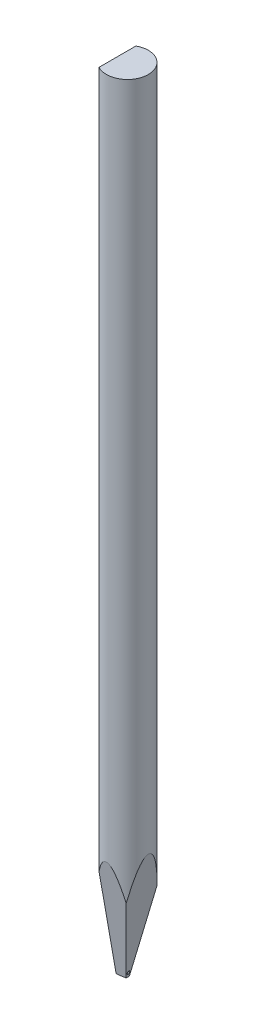
ISO-10303-21;
HEADER;
FILE_DESCRIPTION(('STEP AP214'),'2;1');
FILE_NAME('part.step','',(''),(''),'','','');
FILE_SCHEMA(('AUTOMOTIVE_DESIGN { 1 0 10303 214 1 1 1 1 }'));
ENDSEC;
DATA;
#1=APPLICATION_CONTEXT('core data for automotive mechanical design processes');
#2=APPLICATION_PROTOCOL_DEFINITION('international standard','automotive_design',2000,#1);
#3=PRODUCT_CONTEXT('',#1,'mechanical');
#4=PRODUCT('Part','Part','',(#3));
#5=PRODUCT_RELATED_PRODUCT_CATEGORY('part','',(#4));
#6=PRODUCT_DEFINITION_FORMATION('','',#4);
#7=PRODUCT_DEFINITION_CONTEXT('part definition',#1,'design');
#8=PRODUCT_DEFINITION('design','',#6,#7);
#9=PRODUCT_DEFINITION_SHAPE('','',#8);
#10=(LENGTH_UNIT() NAMED_UNIT(*) SI_UNIT(.MILLI.,.METRE.));
#11=(NAMED_UNIT(*) PLANE_ANGLE_UNIT() SI_UNIT($,.RADIAN.));
#12=(NAMED_UNIT(*) SI_UNIT($,.STERADIAN.) SOLID_ANGLE_UNIT());
#13=UNCERTAINTY_MEASURE_WITH_UNIT(LENGTH_MEASURE(1.E-05),#10,'distance_accuracy_value','');
#14=(GEOMETRIC_REPRESENTATION_CONTEXT(3) GLOBAL_UNCERTAINTY_ASSIGNED_CONTEXT((#13)) GLOBAL_UNIT_ASSIGNED_CONTEXT((#10,
#11,#12)) REPRESENTATION_CONTEXT('',''));
#15=CARTESIAN_POINT('',(0.,0.,0.));
#16=DIRECTION('',(0.,0.,1.));
#17=DIRECTION('',(1.,0.,0.));
#18=AXIS2_PLACEMENT_3D('',#15,#16,#17);
#19=CARTESIAN_POINT('',(0.,0.,0.));
#20=DIRECTION('',(0.,1.,0.));
#21=DIRECTION('',(0.,0.,1.));
#22=AXIS2_PLACEMENT_3D('',#19,#20,#21);
#23=PLANE('',#22);
#24=DIRECTION('',(-1.,0.,0.));
#25=VECTOR('',#24,1.);
#26=CARTESIAN_POINT('',(37.9299393023531,0.,0.024301429259202));
#27=LINE('',#26,#25);
#28=CARTESIAN_POINT('',(-0.302505698926175,0.,0.024301429259202));
#29=VERTEX_POINT('',#28);
#30=CARTESIAN_POINT('',(-0.375920000000002,0.,0.024301429259202));
#31=VERTEX_POINT('',#30);
#32=EDGE_CURVE('E376',#29,#31,#27,.T.);
#33=ORIENTED_EDGE('',*,*,#32,.F.);
#34=CARTESIAN_POINT('',(-0.227825197505043,0.000821082384313734,0.0215810982692062));
#35=CARTESIAN_POINT('',(-0.245034827655447,0.00574587858713153,0.00414270174912001));
#36=CARTESIAN_POINT('',(-0.241524302840157,0.0282854026772107,0.0143490100953686));
#37=CARTESIAN_POINT('',(-0.232761897231027,-0.000191267152315804,0.0250702187356864));
#38=CARTESIAN_POINT('',(-0.245650855646434,0.00566777320241242,0.00770700976054411));
#39=CARTESIAN_POINT('',(-0.244977713848214,0.026157616484449,0.0166688839114718));
#40=CARTESIAN_POINT('',(-0.238431185756585,-0.00123806953368211,0.027930289615228));
#41=CARTESIAN_POINT('',(-0.248388192218129,0.00497262893043278,0.0115103437863978));
#42=CARTESIAN_POINT('',(-0.248913969918457,0.0238423713748454,0.0185705102982331));
#43=CARTESIAN_POINT('',(-0.250793194721189,-0.00297707742583745,0.0322289362925408));
#44=CARTESIAN_POINT('',(-0.255892273738704,0.00341525099514985,0.0177455655134612));
#45=CARTESIAN_POINT('',(-0.257357955889735,0.0193962809886868,0.0214286282586706));
#46=CARTESIAN_POINT('',(-0.257506274585809,-0.00366066852221202,0.0336336714025015));
#47=CARTESIAN_POINT('',(-0.260633657709613,0.00254190370459321,0.0203534609740121));
#48=CARTESIAN_POINT('',(-0.261876654974955,0.0172708330905814,0.0223626195700815));
#49=CARTESIAN_POINT('',(-0.269799835115366,-0.00410994322563168,0.0345696750414885));
#50=CARTESIAN_POINT('',(-0.269751315759274,0.00149116630553639,0.0230126072141926));
#51=CARTESIAN_POINT('',(-0.269946288127882,0.0142679037069781,0.0229849570200847));
#52=CARTESIAN_POINT('',(-0.275323446491675,-0.00403774105700813,0.0344314054213974));
#53=CARTESIAN_POINT('',(-0.274027420527515,0.00118322418916697,0.0235670913464913));
#54=CARTESIAN_POINT('',(-0.273501911955909,0.0132223642176632,0.0228930232292358));
#55=CARTESIAN_POINT('',(-0.286011306031935,-0.00322845548345473,0.0327000352877498));
#56=CARTESIAN_POINT('',(-0.282179914978438,0.00109125813693063,0.0231161412096964));
#57=CARTESIAN_POINT('',(-0.280210477091128,0.0119412986892854,0.0217418562581842));
#58=CARTESIAN_POINT('',(-0.291173148744714,-0.00248730685306159,0.0310980388902579));
#59=CARTESIAN_POINT('',(-0.286149097631656,0.00129894419664579,0.0221276357619358));
#60=CARTESIAN_POINT('',(-0.283360821575895,0.0117107676757025,0.0206767083128105));
#61=CARTESIAN_POINT('',(-0.299602822393734,-0.000801539704433188,0.0267477659134277));
#62=CARTESIAN_POINT('',(-0.292408755866523,0.00191881633869061,0.0190819593298142));
#63=CARTESIAN_POINT('',(-0.288383902424835,0.0118611241504694,0.0177842646529243));
#64=CARTESIAN_POINT('',(-0.303030538955303,0.000103444682686011,0.0241781701007463));
#65=CARTESIAN_POINT('',(-0.294889447090707,0.0023037022246217,0.0171668741087767));
#66=CARTESIAN_POINT('',(-0.290370237180289,0.0121655112151282,0.0160757716097415));
#67=CARTESIAN_POINT('',(-0.308514392850169,0.00172652459697053,0.0183135948687384));
#68=CARTESIAN_POINT('',(-0.298746447297998,0.00298044372071625,0.012879858933677));
#69=CARTESIAN_POINT('',(-0.293503241996811,0.0128466727594801,0.0121764867744927));
#70=CARTESIAN_POINT('',(-0.310606869220775,0.00244921520093865,0.0150414006438955));
#71=CARTESIAN_POINT('',(-0.300152350128904,0.00327523254656574,0.0105128092522198));
#72=CARTESIAN_POINT('',(-0.294672249601443,0.0132211344266295,0.010000844581469));
#73=CARTESIAN_POINT('',(-0.312967619974572,0.00329568497416077,0.00931742185770279));
#74=CARTESIAN_POINT('',(-0.301716686246427,0.00361214202736292,0.00646467066227568));
#75=CARTESIAN_POINT('',(-0.295983169510553,0.013678095082922,0.0061950406152292));
#76=CARTESIAN_POINT('',(-0.313617084874504,0.00354030598861865,0.00697552549228586));
#77=CARTESIAN_POINT('',(-0.302136666185862,0.00370603321499294,0.00483113633064015));
#78=CARTESIAN_POINT('',(-0.29634080920666,0.0138168290783898,0.00463794216868613));
#79=CARTESIAN_POINT('',(-0.314563628458891,0.00389545139863984,0.000787930489150023));
#80=CARTESIAN_POINT('',(-0.302752910089274,0.00384367854693773,0.000535544065680751));
#81=CARTESIAN_POINT('',(-0.296862391385962,0.0140175043608145,0.000523885411308966));
#82=CARTESIAN_POINT('',(-0.314417113795285,0.00383807612208008,-0.00311886327876337));
#83=CARTESIAN_POINT('',(-0.302660770954939,0.00382288355677158,-0.00213939502445816));
#84=CARTESIAN_POINT('',(-0.296782271000047,0.013983779546503,-0.0020736943094739));
#85=CARTESIAN_POINT('',(-0.312657905792592,0.00318275039907247,-0.0106634982811221));
#86=CARTESIAN_POINT('',(-0.301511531396563,0.00356664435177186,-0.00740601427595318));
#87=CARTESIAN_POINT('',(-0.295811667919384,0.0136160577081122,-0.007090030478481));
#88=CARTESIAN_POINT('',(-0.311045007020005,0.0025847242100467,-0.0143013017540773));
#89=CARTESIAN_POINT('',(-0.300461562154091,0.00333278827930966,-0.00998164829714308));
#90=CARTESIAN_POINT('',(-0.294921071680773,0.0132820186114908,-0.00950876181954922));
#91=CARTESIAN_POINT('',(-0.306440159650584,0.00108938252153803,-0.020880290888427));
#92=CARTESIAN_POINT('',(-0.29729910359028,0.00271570653149375,-0.0147410667047117));
#93=CARTESIAN_POINT('',(-0.292324145606441,0.0125632939646946,-0.0138830517805381));
#94=CARTESIAN_POINT('',(-0.30345573705115,0.000193707650167118,-0.0238251473132877));
#95=CARTESIAN_POINT('',(-0.295199673901025,0.00233432378586256,-0.0169294269223584));
#96=CARTESIAN_POINT('',(-0.290622265671655,0.0121788928930591,-0.0158410510464991));
#97=CARTESIAN_POINT('',(-0.296432365420741,-0.00148605921301844,-0.028628143513798));
#98=CARTESIAN_POINT('',(-0.290078907132247,0.00166019233881121,-0.0204132760605369));
#99=CARTESIAN_POINT('',(-0.286507609386632,0.0117486224899564,-0.0190345048786184));
#100=CARTESIAN_POINT('',(-0.292421815697956,-0.00227239044141986,-0.0305117439313388));
#101=CARTESIAN_POINT('',(-0.287063238453745,0.00136248817850754,-0.0217461800460033));
#102=CARTESIAN_POINT('',(-0.284113782114589,0.0116944848100444,-0.0202868879163018));
#103=CARTESIAN_POINT('',(-0.283849340075187,-0.00342900818647396,-0.0331572963874476));
#104=CARTESIAN_POINT('',(-0.280569772361123,0.0010856610224745,-0.0233043318321131));
#105=CARTESIAN_POINT('',(-0.278862882478683,0.0121596022092071,-0.0220458836090603));
#106=CARTESIAN_POINT('',(-0.279295190972908,-0.00380452880153439,-0.0339333987496222));
#107=CARTESIAN_POINT('',(-0.277047639383919,0.00110327745740793,-0.023545154910523));
#108=CARTESIAN_POINT('',(-0.276012181647064,0.0126714724574782,-0.0225619046424186));
#109=CARTESIAN_POINT('',(-0.269701463152515,-0.00410629730163296,-0.0345630378480585));
#110=CARTESIAN_POINT('',(-0.269746394801657,0.00148426748942568,-0.0229936986933425));
#111=CARTESIAN_POINT('',(-0.269881702633036,0.0142919892466934,-0.0229805440307946));
#112=CARTESIAN_POINT('',(-0.264653504068372,-0.00399168402953402,-0.0343326317027686));
#113=CARTESIAN_POINT('',(-0.2659129984888,0.00189006473089505,-0.0220765629153878));
#114=CARTESIAN_POINT('',(-0.266586044859265,0.0154476236056216,-0.0228273497835158));
#115=CARTESIAN_POINT('',(-0.253793893841115,-0.00329673403971204,-0.0328464784638622));
#116=CARTESIAN_POINT('',(-0.25804777168414,0.00299938327773119,-0.0189984846186303));
#117=CARTESIAN_POINT('',(-0.259381389799495,0.0184306001459407,-0.0218392245471482));
#118=CARTESIAN_POINT('',(-0.248036924026835,-0.00262603076696128,-0.0313908642611835));
#119=CARTESIAN_POINT('',(-0.25412124898949,0.00376990506999124,-0.0165248798583642));
#120=CARTESIAN_POINT('',(-0.255484648351846,0.0203469392501991,-0.0208714043450132));
#121=CARTESIAN_POINT('',(-0.239413210970669,-0.00134157330358348,-0.028165632697237));
#122=CARTESIAN_POINT('',(-0.249253851903819,0.00480639473717398,-0.0119576174475555));
#123=CARTESIAN_POINT('',(-0.24957588621242,0.0235275660937497,-0.0187269870547679));
#124=CARTESIAN_POINT('',(-0.236308205853108,-0.000811429626366428,-0.0267516692029636));
#125=CARTESIAN_POINT('',(-0.24771983337294,0.0051601389311344,-0.0100184273300864));
#126=CARTESIAN_POINT('',(-0.247431093294174,0.0247477519269788,-0.0177868599027238));
#127=CARTESIAN_POINT('',(-0.230477145019733,0.000272654770886545,-0.0234963613029371));
#128=CARTESIAN_POINT('',(-0.245473970538167,0.00567015630017144,-0.00606795690835905));
#129=CARTESIAN_POINT('',(-0.243380619980735,0.0271372754227797,-0.0156224452219534));
#130=CARTESIAN_POINT('',(-0.227751727404986,0.000826633560826962,-0.0216543108103016));
#131=CARTESIAN_POINT('',(-0.244812549085203,0.00581424778672661,-0.00404223108031309));
#132=CARTESIAN_POINT('',(-0.241475342731792,0.0283065252460894,-0.0143976882246357));
#133=CARTESIAN_POINT('',(-0.225275643428538,0.00135586198968455,-0.0195888989002276));
#134=CARTESIAN_POINT('',(-0.244757355961534,0.00576877420614223,-0.00225342325622203));
#135=CARTESIAN_POINT('',(-0.239737733013406,0.0293975411594971,-0.0130244209340158));
#136=(BOUNDED_SURFACE() B_SPLINE_SURFACE(3,2,((#34,#35,#36),(#37,#38,#39),(#40,#41,#42),(#43,
#44,#45),(#46,#47,#48),(#49,#50,#51),(#52,#53,#54),(#55,#56,#57),(#58,#59,#60),(#61,#62,#63),
(#64,#65,#66),(#67,#68,#69),(#70,#71,#72),(#73,#74,#75),(#76,#77,#78),(#79,#80,#81),(#82,#83,
#84),(#85,#86,#87),(#88,#89,#90),(#91,#92,#93),(#94,#95,#96),(#97,#98,#99),(#100,#101,#102),
(#103,#104,#105),(#106,#107,#108),(#109,#110,#111),(#112,#113,#114),(#115,#116,#117),(#118,#119,
#120),(#121,#122,#123),(#124,#125,#126),(#127,#128,#129),(#130,#131,#132),(#133,#134,#135)),
.UNSPECIFIED.,.F.,.F.,.F.) B_SPLINE_SURFACE_WITH_KNOTS((4,2,2,2,2,2,2,2,2,2,2,2,2,2,2,2,4),(3,
3),(0.,0.0201539584671881,0.0407666975654291,0.0570670854146052,0.0734672035679023,
0.0877081664327257,0.101542859946109,0.110571495241634,0.125004171594238,0.139438870208372,
0.153795289694016,0.167790761380671,0.181605763093261,0.19659395858546,0.214644351189683,
0.225509394554146,0.236392487536961),(0.,1.),
.UNSPECIFIED.) GEOMETRIC_REPRESENTATION_ITEM() RATIONAL_B_SPLINE_SURFACE(((1.,0.630877932053694,
1.),(1.,0.672074069199554,1.),(1.,0.710262779390349,1.),(1.,0.777863435183107,1.),(1.,
0.807055799266452,1.),(1.,0.847025625113269,1.),(1.,0.860377941141275,1.),(1.,0.877904377756496,
1.),(1.,0.882021843771012,1.),(1.,0.883303214852003,1.),(1.,0.881311221974648,1.),(1.,
0.876025044633842,1.),(1.,0.872769630583407,1.),(1.,0.868698546182562,1.),(1.,0.867428195714935,
1.),(1.,0.86559550462401,1.),(1.,0.865912049725688,1.),(1.,0.869253613703966,1.),(1.,
0.872279012077236,1.),(1.,0.878303632729241,1.),(1.,0.881302907987323,1.),(1.,0.883414326053349,
1.),(1.,0.88262230290473,1.),(1.,0.874779530792039,1.),(1.,0.867809619062972,1.),(1.,
0.846482034914803,1.),(1.,0.831547246020609,1.),(1.,0.791082953057688,1.),(1.,0.764012271614353,
1.),(1.,0.714444681703178,1.),(1.,0.694416731867675,1.),(1.,0.652735964736715,1.),(1.,
0.631080503393025,1.),(1.,0.60923796740264,1.))) REPRESENTATION_ITEM('') SURFACE());
#137=CARTESIAN_POINT('',(-0.302505698926173,0.,0.0243014292591998));
#138=CARTESIAN_POINT('',(-0.301189653751042,0.,0.0243303034984779));
#139=CARTESIAN_POINT('',(-0.299893265882524,0.,0.0244879989132688));
#140=CARTESIAN_POINT('',(-0.297321845085298,0.,0.0249318934199553));
#141=CARTESIAN_POINT('',(-0.296046791417956,0.,0.0252179591691541));
#142=CARTESIAN_POINT('',(-0.29223043850594,0.,0.0260743698526111));
#143=CARTESIAN_POINT('',(-0.28969025145603,0.,0.0266446536985803));
#144=CARTESIAN_POINT('',(-0.284577115121523,0.,0.0276215558975383));
#145=CARTESIAN_POINT('',(-0.282004128745236,0.,0.0280279681026352));
#146=CARTESIAN_POINT('',(-0.27939999999899,0.,0.0282696689974253));
#147=B_SPLINE_CURVE_WITH_KNOTS('',3,(#137,#138,#139,#140,#141,#142,#143,#144,#145,#146),
.UNSPECIFIED.,.F.,.F.,(4,2,2,2,4),(0.,0.00392016575312297,0.00783626888681539,
0.0156448592896654,0.0234632423546317),.UNSPECIFIED.);
#148=CARTESIAN_POINT('',(-0.2794,0.,0.0282696690019624));
#149=VERTEX_POINT('',#148);
#150=EDGE_CURVE('E300',#29,#149,#147,.T.);
#151=ORIENTED_EDGE('',*,*,#150,.T.);
#152=DIRECTION('',(0.,0.,-1.));
#153=VECTOR('',#152,1.);
#154=CARTESIAN_POINT('',(-0.2794,0.,37.6441893023531));
#155=LINE('',#154,#153);
#156=CARTESIAN_POINT('',(-0.279399999999989,0.,0.0507999999999916));
#157=VERTEX_POINT('',#156);
#158=EDGE_CURVE('E374',#157,#149,#155,.T.);
#159=ORIENTED_EDGE('',*,*,#158,.F.);
#160=DIRECTION('',(-1.,0.,0.));
#161=VECTOR('',#160,1.);
#162=CARTESIAN_POINT('',(38.0505893023531,0.,0.0508));
#163=LINE('',#162,#161);
#164=CARTESIAN_POINT('',(-0.375920000000002,0.,0.0508));
#165=VERTEX_POINT('',#164);
#166=EDGE_CURVE('E446',#157,#165,#163,.T.);
#167=ORIENTED_EDGE('',*,*,#166,.T.);
#168=DIRECTION('',(0.,0.,1.));
#169=VECTOR('',#168,1.);
#170=CARTESIAN_POINT('',(-0.37592,0.,-0.697645113220181));
#171=LINE('',#170,#169);
#172=EDGE_CURVE('E386',#31,#165,#171,.T.);
#173=ORIENTED_EDGE('',*,*,#172,.F.);
#174=EDGE_LOOP('',(#33,#151,#159,#167,#173));
#175=FACE_BOUND('',#174,.T.);
#176=ADVANCED_FACE('F46',(#175),#23,.F.);
#177=CARTESIAN_POINT('',(-0.22414416739421,0.09398,0.));
#178=DIRECTION('',(-0.499999999999998,-0.86602540378444,0.));
#179=DIRECTION('',(0.86602540378444,-0.499999999999998,0.));
#180=AXIS2_PLACEMENT_3D('',#177,#178,#179);
#181=CYLINDRICAL_SURFACE('',#180,0.02286);
#182=DIRECTION('',(-0.499999999999998,-0.86602540378444,0.));
#183=VECTOR('',#182,1.);
#184=CARTESIAN_POINT('',(-0.208802659269489,0.120552271536748,0.02286));
#185=LINE('',#184,#183);
#186=CARTESIAN_POINT('',(-0.22414416739421,0.09398,0.02286));
#187=VERTEX_POINT('',#186);
#188=CARTESIAN_POINT('',(-0.270149117557675,0.0142970889172039,0.02286));
#189=VERTEX_POINT('',#188);
#190=EDGE_CURVE('E369',#187,#189,#185,.T.);
#191=ORIENTED_EDGE('',*,*,#190,.T.);
#192=CARTESIAN_POINT('',(-0.241524302840157,0.0282854026772107,0.0143490100953686));
#193=CARTESIAN_POINT('',(-0.244977713848214,0.026157616484449,0.0166688839114718));
#194=CARTESIAN_POINT('',(-0.248913969918457,0.0238423713748454,0.0185705102982331));
#195=CARTESIAN_POINT('',(-0.257357955889735,0.0193962809886868,0.0214286282586705));
#196=CARTESIAN_POINT('',(-0.261876654974955,0.0172708330905814,0.0223626195700815));
#197=CARTESIAN_POINT('',(-0.269946288127882,0.0142679037069781,0.0229849570200847));
#198=CARTESIAN_POINT('',(-0.273501911955909,0.0132223642176632,0.0228930232292358));
#199=CARTESIAN_POINT('',(-0.280210477091128,0.0119412986892854,0.0217418562581842));
#200=CARTESIAN_POINT('',(-0.283360821575895,0.0117107676757025,0.0206767083128105));
#201=CARTESIAN_POINT('',(-0.288383902424835,0.0118611241504694,0.0177842646529243));
#202=CARTESIAN_POINT('',(-0.290370237180289,0.0121655112151282,0.0160757716097415));
#203=CARTESIAN_POINT('',(-0.293503241996811,0.0128466727594801,0.0121764867744927));
#204=CARTESIAN_POINT('',(-0.294672249601443,0.0132211344266295,0.010000844581469));
#205=CARTESIAN_POINT('',(-0.295983169510553,0.013678095082922,0.0061950406152292));
#206=CARTESIAN_POINT('',(-0.29634080920666,0.0138168290783898,0.00463794216868613));
#207=CARTESIAN_POINT('',(-0.296862391385962,0.0140175043608145,0.000523885411308965));
#208=CARTESIAN_POINT('',(-0.296782271000047,0.013983779546503,-0.0020736943094739));
#209=CARTESIAN_POINT('',(-0.295811667919384,0.0136160577081122,-0.007090030478481));
#210=CARTESIAN_POINT('',(-0.294921071680773,0.0132820186114908,-0.00950876181954922));
#211=CARTESIAN_POINT('',(-0.292324145606441,0.0125632939646946,-0.0138830517805381));
#212=CARTESIAN_POINT('',(-0.290622265671655,0.0121788928930591,-0.0158410510464991));
#213=CARTESIAN_POINT('',(-0.286507609386632,0.0117486224899564,-0.0190345048786184));
#214=CARTESIAN_POINT('',(-0.284113782114589,0.0116944848100444,-0.0202868879163018));
#215=CARTESIAN_POINT('',(-0.278862882478683,0.0121596022092071,-0.0220458836090603));
#216=CARTESIAN_POINT('',(-0.276012181647063,0.0126714724574782,-0.0225619046424186));
#217=CARTESIAN_POINT('',(-0.269881702633036,0.0142919892466934,-0.0229805440307946));
#218=CARTESIAN_POINT('',(-0.266586044859265,0.0154476236056216,-0.0228273497835158));
#219=CARTESIAN_POINT('',(-0.259381389799495,0.0184306001459407,-0.0218392245471482));
#220=CARTESIAN_POINT('',(-0.255484648351846,0.0203469392501991,-0.0208714043450132));
#221=CARTESIAN_POINT('',(-0.24957588621242,0.0235275660937497,-0.0187269870547679));
#222=CARTESIAN_POINT('',(-0.247431093294174,0.0247477519269788,-0.0177868599027238));
#223=CARTESIAN_POINT('',(-0.243380619980735,0.0271372754227797,-0.0156224452219534));
#224=CARTESIAN_POINT('',(-0.241475342731792,0.0283065252460894,-0.0143976882246358));
#225=CARTESIAN_POINT('',(-0.239737733013406,0.0293975411594971,-0.0130244209340158));
#226=B_SPLINE_CURVE_WITH_KNOTS('',3,(#192,#193,#194,#195,#196,#197,#198,#199,#200,#201,#202,
#203,#204,#205,#206,#207,#208,#209,#210,#211,#212,#213,#214,#215,#216,#217,#218,#219,#220,#221,
#222,#223,#224,#225),.UNSPECIFIED.,.F.,.F.,(4,2,2,2,2,2,2,2,2,2,2,2,2,2,2,2,4),(0.,
0.0201539584671881,0.0407666975654291,0.0570670854146052,0.0734672035679023,0.0877081664327257,
0.101542859946109,0.110571495241634,0.125004171594238,0.139438870208372,0.153795289694016,
0.167790761380671,0.181605763093261,0.19659395858546,0.214644351189683,0.225509394554146,
0.236392487536961),.UNSPECIFIED.);
#227=CARTESIAN_POINT('',(-0.270149117557506,0.0142970889174967,-0.02286));
#228=VERTEX_POINT('',#227);
#229=EDGE_CURVE('E67',#189,#228,#226,.T.);
#230=ORIENTED_EDGE('',*,*,#229,.T.);
#231=DIRECTION('',(0.499999999999998,0.86602540378444,0.));
#232=VECTOR('',#231,1.);
#233=CARTESIAN_POINT('',(-0.22414416739421,0.09398,-0.02286));
#234=LINE('',#233,#232);
#235=CARTESIAN_POINT('',(-0.22414416739421,0.09398,-0.02286));
#236=VERTEX_POINT('',#235);
#237=EDGE_CURVE('E365',#228,#236,#234,.T.);
#238=ORIENTED_EDGE('',*,*,#237,.T.);
#239=CARTESIAN_POINT('',(-0.22414416739421,0.09398,0.));
#240=DIRECTION('',(0.,-1.,0.));
#241=DIRECTION('',(-1.,0.,0.));
#242=AXIS2_PLACEMENT_3D('',#239,#240,#241);
#243=ELLIPSE('',#242,0.0263964543073497,0.02286);
#244=EDGE_CURVE('E368',#236,#187,#243,.F.);
#245=ORIENTED_EDGE('',*,*,#244,.T.);
#246=EDGE_LOOP('',(#191,#230,#238,#245));
#247=FACE_BOUND('',#246,.T.);
#248=ADVANCED_FACE('F221',(#247),#181,.F.);
#249=CARTESIAN_POINT('',(0.,0.,0.02286));
#250=DIRECTION('',(0.,0.,-1.));
#251=DIRECTION('',(-1.,0.,0.));
#252=AXIS2_PLACEMENT_3D('',#249,#250,#251);
#253=PLANE('',#252);
#254=DIRECTION('',(-0.984807753012208,-0.173648177666931,0.));
#255=VECTOR('',#254,1.);
#256=CARTESIAN_POINT('',(-0.2794,0.,0.0228599999999995));
#257=LINE('',#256,#255);
#258=CARTESIAN_POINT('',(-0.1143,0.0291115845149677,0.0228599999999998));
#259=VERTEX_POINT('',#258);
#260=CARTESIAN_POINT('',(-0.252368938397868,0.00476630547764848,0.0228599999999995));
#261=VERTEX_POINT('',#260);
#262=EDGE_CURVE('E301',#259,#261,#257,.T.);
#263=ORIENTED_EDGE('',*,*,#262,.T.);
#264=CARTESIAN_POINT('',(-0.252368938397868,0.00476630547764848,0.0228599999999995));
#265=CARTESIAN_POINT('',(-0.258415752421945,0.00697972986525133,0.0228599999992844));
#266=CARTESIAN_POINT('',(-0.264012984747342,0.00991787427757624,0.0228599999992846));
#267=CARTESIAN_POINT('',(-0.269491992306078,0.0138165191920229,0.022860000000046));
#268=CARTESIAN_POINT('',(-0.269821486367798,0.0140553025928321,0.0228600000000951));
#269=CARTESIAN_POINT('',(-0.270149117559222,0.0142970889170507,0.022860000000147));
#270=B_SPLINE_CURVE_WITH_KNOTS('',3,(#264,#265,#266,#267,#268,#269),.UNSPECIFIED.,.F.,.F.,(4,2,
4),(0.,0.0189645806868845,0.0201853405497978),.UNSPECIFIED.);
#271=EDGE_CURVE('E75',#261,#189,#270,.T.);
#272=ORIENTED_EDGE('',*,*,#271,.T.);
#273=ORIENTED_EDGE('',*,*,#190,.F.);
#274=DIRECTION('',(-1.,0.,0.));
#275=VECTOR('',#274,1.);
#276=CARTESIAN_POINT('',(-0.25054062170156,0.09398,0.02286));
#277=LINE('',#276,#275);
#278=CARTESIAN_POINT('',(-0.121701865104678,0.09398,0.02286));
#279=VERTEX_POINT('',#278);
#280=EDGE_CURVE('E191',#279,#187,#277,.T.);
#281=ORIENTED_EDGE('',*,*,#280,.F.);
#282=CARTESIAN_POINT('',(-0.1143,0.09398,0.02286));
#283=VERTEX_POINT('',#282);
#284=EDGE_CURVE('E177',#283,#279,#277,.T.);
#285=ORIENTED_EDGE('',*,*,#284,.F.);
#286=DIRECTION('',(0.,1.,0.));
#287=VECTOR('',#286,1.);
#288=CARTESIAN_POINT('',(-0.1143,0.09398,0.02286));
#289=LINE('',#288,#287);
#290=EDGE_CURVE('E166',#259,#283,#289,.T.);
#291=ORIENTED_EDGE('',*,*,#290,.F.);
#292=EDGE_LOOP('',(#263,#272,#273,#281,#285,#291));
#293=FACE_BOUND('',#292,.T.);
#294=ADVANCED_FACE('F189',(#293),#253,.T.);
#295=CARTESIAN_POINT('',(0.,0.,-0.02286));
#296=DIRECTION('',(0.,0.,-1.));
#297=DIRECTION('',(-1.,0.,0.));
#298=AXIS2_PLACEMENT_3D('',#295,#296,#297);
#299=PLANE('',#298);
#300=ORIENTED_EDGE('',*,*,#237,.F.);
#301=CARTESIAN_POINT('',(-0.252368938397868,0.00476630547764848,-0.0228599999999995));
#302=CARTESIAN_POINT('',(-0.258415752425477,0.00697972985975805,-0.0228599999999964));
#303=CARTESIAN_POINT('',(-0.264012984750581,0.00991787427187431,-0.0228599999999965));
#304=CARTESIAN_POINT('',(-0.269491992304944,0.0138165191917322,-0.0228600000000002));
#305=CARTESIAN_POINT('',(-0.269821486366396,0.0140553025928986,-0.0228600000000005));
#306=CARTESIAN_POINT('',(-0.270149117557534,0.0142970889174966,-0.0228600000000007));
#307=B_SPLINE_CURVE_WITH_KNOTS('',3,(#301,#302,#303,#304,#305,#306),.UNSPECIFIED.,.F.,.F.,(4,2,
4),(0.,0.0189645806858143,0.0201853405487022),.UNSPECIFIED.);
#308=CARTESIAN_POINT('',(-0.252368938397868,0.00476630547764848,-0.0228599999999995));
#309=VERTEX_POINT('',#308);
#310=EDGE_CURVE('E60',#228,#309,#307,.F.);
#311=ORIENTED_EDGE('',*,*,#310,.T.);
#312=DIRECTION('',(-0.984807753012208,-0.173648177666931,0.));
#313=VECTOR('',#312,1.);
#314=CARTESIAN_POINT('',(-0.2794,0.,-0.0228599999999995));
#315=LINE('',#314,#313);
#316=CARTESIAN_POINT('',(-0.1143,0.0291115845149677,-0.0228599999999998));
#317=VERTEX_POINT('',#316);
#318=EDGE_CURVE('E392',#317,#309,#315,.T.);
#319=ORIENTED_EDGE('',*,*,#318,.F.);
#320=DIRECTION('',(0.,1.,0.));
#321=VECTOR('',#320,1.);
#322=CARTESIAN_POINT('',(-0.1143,0.09398,-0.02286));
#323=LINE('',#322,#321);
#324=CARTESIAN_POINT('',(-0.1143,0.09398,-0.02286));
#325=VERTEX_POINT('',#324);
#326=EDGE_CURVE('E196',#317,#325,#323,.T.);
#327=ORIENTED_EDGE('',*,*,#326,.T.);
#328=DIRECTION('',(-1.,0.,0.));
#329=VECTOR('',#328,1.);
#330=CARTESIAN_POINT('',(-0.25054062170156,0.09398,-0.02286));
#331=LINE('',#330,#329);
#332=CARTESIAN_POINT('',(-0.121701865104678,0.09398,-0.02286));
#333=VERTEX_POINT('',#332);
#334=EDGE_CURVE('E201',#325,#333,#331,.T.);
#335=ORIENTED_EDGE('',*,*,#334,.T.);
#336=EDGE_CURVE('E205',#333,#236,#331,.T.);
#337=ORIENTED_EDGE('',*,*,#336,.T.);
#338=EDGE_LOOP('',(#300,#311,#319,#327,#335,#337));
#339=FACE_BOUND('',#338,.T.);
#340=ADVANCED_FACE('F248',(#339),#299,.F.);
#341=CARTESIAN_POINT('',(-0.2794,0.,-0.0282696689971954));
#342=VERTEX_POINT('',#341);
#343=CARTESIAN_POINT('',(-0.279399999999989,0.,-0.0508000000000054));
#344=VERTEX_POINT('',#343);
#345=EDGE_CURVE('E371',#342,#344,#155,.T.);
#346=ORIENTED_EDGE('',*,*,#345,.F.);
#347=CARTESIAN_POINT('',(-0.2794,0.,-0.0282696689971954));
#348=CARTESIAN_POINT('',(-0.281345639865883,0.,-0.0280696594245745));
#349=CARTESIAN_POINT('',(-0.283281501702588,0.,-0.02780042612144));
#350=CARTESIAN_POINT('',(-0.287134331719711,0.,-0.0271519507510644));
#351=CARTESIAN_POINT('',(-0.28905130588931,0.,-0.0267727447977257));
#352=CARTESIAN_POINT('',(-0.29286940485298,0.,-0.0259323507371869));
#353=CARTESIAN_POINT('',(-0.294770519807286,0.,-0.0254711151977177));
#354=CARTESIAN_POINT('',(-0.298604012110879,0.,-0.0247067414256691));
#355=CARTESIAN_POINT('',(-0.300536434586142,0.,-0.0244038571584293));
#356=CARTESIAN_POINT('',(-0.302505698926471,0.,-0.0243014292605922));
#357=B_SPLINE_CURVE_WITH_KNOTS('',3,(#347,#348,#349,#350,#351,#352,#353,#354,#355,#356),
.UNSPECIFIED.,.F.,.F.,(4,2,2,2,4),(0.,0.00586218927175541,0.0117224556356863,0.0175861216860616,
0.0234591633143403),.UNSPECIFIED.);
#358=CARTESIAN_POINT('',(-0.302505698926168,0.,-0.024301429259202));
#359=VERTEX_POINT('',#358);
#360=EDGE_CURVE('E11',#342,#359,#357,.T.);
#361=ORIENTED_EDGE('',*,*,#360,.T.);
#362=DIRECTION('',(-1.,0.,0.));
#363=VECTOR('',#362,1.);
#364=CARTESIAN_POINT('',(37.9299393023531,0.,-0.024301429259202));
#365=LINE('',#364,#363);
#366=CARTESIAN_POINT('',(-0.375920000000002,0.,-0.024301429259202));
#367=VERTEX_POINT('',#366);
#368=EDGE_CURVE('E379',#359,#367,#365,.T.);
#369=ORIENTED_EDGE('',*,*,#368,.T.);
#370=CARTESIAN_POINT('',(-0.37592,0.,-0.0508));
#371=VERTEX_POINT('',#370);
#372=EDGE_CURVE('E389',#371,#367,#171,.T.);
#373=ORIENTED_EDGE('',*,*,#372,.F.);
#374=DIRECTION('',(-1.,0.,0.));
#375=VECTOR('',#374,1.);
#376=CARTESIAN_POINT('',(38.0505893023531,0.,-0.0508));
#377=LINE('',#376,#375);
#378=EDGE_CURVE('E503',#344,#371,#377,.T.);
#379=ORIENTED_EDGE('',*,*,#378,.F.);
#380=EDGE_LOOP('',(#346,#361,#369,#373,#379));
#381=FACE_BOUND('',#380,.T.);
#382=ADVANCED_FACE('F252',(#381),#23,.F.);
#383=CARTESIAN_POINT('',(0.,29.999999944,0.));
#384=DIRECTION('',(0.,1.,0.));
#385=DIRECTION('',(0.,0.,1.));
#386=AXIS2_PLACEMENT_3D('',#383,#384,#385);
#387=PLANE('',#386);
#388=CARTESIAN_POINT('',(0.,29.999999944,0.));
#389=DIRECTION('',(0.,1.,0.));
#390=DIRECTION('',(0.,0.,1.));
#391=AXIS2_PLACEMENT_3D('',#388,#389,#390);
#392=CIRCLE('',#391,0.79248);
#393=CARTESIAN_POINT('',(-0.37592,29.999999944,0.697645113220181));
#394=VERTEX_POINT('',#393);
#395=CARTESIAN_POINT('',(-0.37592,29.999999944,-0.697645113220181));
#396=VERTEX_POINT('',#395);
#397=EDGE_CURVE('E463',#394,#396,#392,.T.);
#398=ORIENTED_EDGE('',*,*,#397,.T.);
#399=DIRECTION('',(0.,0.,1.));
#400=VECTOR('',#399,1.);
#401=CARTESIAN_POINT('',(-0.37592,29.999999944,0.));
#402=LINE('',#401,#400);
#403=EDGE_CURVE('E474',#396,#394,#402,.T.);
#404=ORIENTED_EDGE('',*,*,#403,.T.);
#405=EDGE_LOOP('',(#398,#404));
#406=FACE_BOUND('',#405,.T.);
#407=ADVANCED_FACE('F314',(#406),#387,.T.);
#408=CARTESIAN_POINT('',(0.,29.999999944,0.));
#409=DIRECTION('',(0.,-1.,0.));
#410=DIRECTION('',(0.,0.,-1.));
#411=AXIS2_PLACEMENT_3D('',#408,#409,#410);
#412=CYLINDRICAL_SURFACE('',#411,0.79248);
#413=CARTESIAN_POINT('',(0.,-0.288101116436578,0.));
#414=DIRECTION('',(0.,0.173648177666931,-0.984807753012208));
#415=DIRECTION('',(0.,-0.984807753012208,-0.173648177666931));
#416=AXIS2_PLACEMENT_3D('',#413,#414,#415);
#417=ELLIPSE('',#416,4.56371043248165,0.79248);
#418=CARTESIAN_POINT('',(-0.37592,3.66844093071416,0.697645113220181));
#419=VERTEX_POINT('',#418);
#420=CARTESIAN_POINT('',(0.537041505266773,3.01690361355593,0.582761505266776));
#421=VERTEX_POINT('',#420);
#422=EDGE_CURVE('E466',#419,#421,#417,.T.);
#423=ORIENTED_EDGE('',*,*,#422,.T.);
#424=CARTESIAN_POINT('',(0.,-0.0288101116436568,0.));
#425=DIRECTION('',(-0.984807753012208,0.173648177666931,0.));
#426=DIRECTION('',(-0.173648177666931,-0.984807753012208,0.));
#427=AXIS2_PLACEMENT_3D('',#424,#425,#426);
#428=ELLIPSE('',#427,4.56371043248166,0.79248);
#429=CARTESIAN_POINT('',(0.537041505266774,3.01690361355592,-0.582761505266776));
#430=VERTEX_POINT('',#429);
#431=EDGE_CURVE('E495',#421,#430,#428,.T.);
#432=ORIENTED_EDGE('',*,*,#431,.T.);
#433=CARTESIAN_POINT('',(0.,-0.288101116436578,0.));
#434=DIRECTION('',(0.,0.173648177666931,0.984807753012208));
#435=DIRECTION('',(0.,-0.984807753012208,0.173648177666931));
#436=AXIS2_PLACEMENT_3D('',#433,#434,#435);
#437=ELLIPSE('',#436,4.56371043248164,0.79248);
#438=CARTESIAN_POINT('',(-0.37592,3.66844093071416,-0.697645113220182));
#439=VERTEX_POINT('',#438);
#440=EDGE_CURVE('E498',#430,#439,#437,.T.);
#441=ORIENTED_EDGE('',*,*,#440,.T.);
#442=DIRECTION('',(0.,1.,0.));
#443=VECTOR('',#442,1.);
#444=CARTESIAN_POINT('',(-0.37592,0.,-0.697645113220181));
#445=LINE('',#444,#443);
#446=EDGE_CURVE('E390',#439,#396,#445,.T.);
#447=ORIENTED_EDGE('',*,*,#446,.T.);
#448=ORIENTED_EDGE('',*,*,#397,.F.);
#449=DIRECTION('',(0.,1.,0.));
#450=VECTOR('',#449,1.);
#451=CARTESIAN_POINT('',(-0.37592,0.,0.697645113220181));
#452=LINE('',#451,#450);
#453=EDGE_CURVE('E459',#419,#394,#452,.T.);
#454=ORIENTED_EDGE('',*,*,#453,.F.);
#455=EDGE_LOOP('',(#423,#432,#441,#447,#448,#454));
#456=FACE_BOUND('',#455,.T.);
#457=ADVANCED_FACE('F311',(#456),#412,.T.);
#458=CARTESIAN_POINT('',(-0.37592,0.,-0.697645113220181));
#459=DIRECTION('',(-1.,0.,0.));
#460=DIRECTION('',(0.,0.,1.));
#461=AXIS2_PLACEMENT_3D('',#458,#459,#460);
#462=PLANE('',#461);
#463=ORIENTED_EDGE('',*,*,#372,.T.);
#464=CARTESIAN_POINT('',(-0.375920000000002,-0.075596242,0.));
#465=DIRECTION('',(-1.,0.,0.));
#466=DIRECTION('',(0.,0.,1.));
#467=AXIS2_PLACEMENT_3D('',#464,#465,#466);
#468=CIRCLE('',#467,0.079406242);
#469=EDGE_CURVE('E198',#367,#31,#468,.F.);
#470=ORIENTED_EDGE('',*,*,#469,.T.);
#471=ORIENTED_EDGE('',*,*,#172,.T.);
#472=DIRECTION('',(0.,-0.984807753012208,-0.173648177666931));
#473=VECTOR('',#472,1.);
#474=CARTESIAN_POINT('',(-0.37592,-0.127991652447482,0.0282316183680482));
#475=LINE('',#474,#473);
#476=EDGE_CURVE('E450',#419,#165,#475,.T.);
#477=ORIENTED_EDGE('',*,*,#476,.F.);
#478=ORIENTED_EDGE('',*,*,#453,.T.);
#479=ORIENTED_EDGE('',*,*,#403,.F.);
#480=ORIENTED_EDGE('',*,*,#446,.F.);
#481=DIRECTION('',(0.,0.984807753012208,-0.173648177666931));
#482=VECTOR('',#481,1.);
#483=CARTESIAN_POINT('',(-0.37592,0.110617029166538,-0.0703047667678759));
#484=LINE('',#483,#482);
#485=EDGE_CURVE('E456',#371,#439,#484,.T.);
#486=ORIENTED_EDGE('',*,*,#485,.F.);
#487=EDGE_LOOP('',(#463,#470,#471,#477,#478,#479,#480,#486));
#488=FACE_BOUND('',#487,.T.);
#489=ADVANCED_FACE('F313',(#488),#462,.T.);
#490=CARTESIAN_POINT('',(38.0505893023531,0.,-0.0508));
#491=DIRECTION('',(0.,0.173648177666931,0.984807753012208));
#492=DIRECTION('',(0.,-0.984807753012208,0.173648177666931));
#493=AXIS2_PLACEMENT_3D('',#490,#491,#492);
#494=PLANE('',#493);
#495=ORIENTED_EDGE('',*,*,#440,.F.);
#496=DIRECTION('',(-0.171087869746036,-0.970287525247814,0.171087869746036));
#497=VECTOR('',#496,1.);
#498=CARTESIAN_POINT('',(1.11871235410314,6.31572292356323,-1.16443235410315));
#499=LINE('',#498,#497);
#500=CARTESIAN_POINT('',(0.0142086463569854,0.0517711261220263,-0.0599286463569818));
#501=VERTEX_POINT('',#500);
#502=EDGE_CURVE('E508',#430,#501,#499,.T.);
#503=ORIENTED_EDGE('',*,*,#502,.T.);
#504=DIRECTION('',(-0.984346441568213,-0.173566836012845,0.0306045161452665));
#505=VECTOR('',#504,1.);
#506=CARTESIAN_POINT('',(36.8599799943277,6.54867473978421,-1.20550804450795));
#507=LINE('',#506,#505);
#508=EDGE_CURVE('E514',#501,#344,#507,.T.);
#509=ORIENTED_EDGE('',*,*,#508,.T.);
#510=ORIENTED_EDGE('',*,*,#378,.T.);
#511=ORIENTED_EDGE('',*,*,#485,.T.);
#512=EDGE_LOOP('',(#495,#503,#509,#510,#511));
#513=FACE_BOUND('',#512,.T.);
#514=ADVANCED_FACE('F326',(#513),#494,.F.);
#515=CARTESIAN_POINT('',(38.0505893023531,0.,0.0508));
#516=DIRECTION('',(0.,0.173648177666931,-0.984807753012208));
#517=DIRECTION('',(0.,0.984807753012208,0.173648177666931));
#518=AXIS2_PLACEMENT_3D('',#515,#516,#517);
#519=PLANE('',#518);
#520=DIRECTION('',(0.984346441568213,0.173566836012845,0.0306045161452664));
#521=VECTOR('',#520,1.);
#522=CARTESIAN_POINT('',(36.8599799943277,6.54867473978421,1.20550804450795));
#523=LINE('',#522,#521);
#524=CARTESIAN_POINT('',(0.0142086463569766,0.0517711261220234,0.0599286463569735));
#525=VERTEX_POINT('',#524);
#526=EDGE_CURVE('E482',#157,#525,#523,.T.);
#527=ORIENTED_EDGE('',*,*,#526,.T.);
#528=DIRECTION('',(0.171087869746036,0.970287525247814,0.171087869746036));
#529=VECTOR('',#528,1.);
#530=CARTESIAN_POINT('',(1.11871235410314,6.31572292356323,1.16443235410315));
#531=LINE('',#530,#529);
#532=EDGE_CURVE('E396',#525,#421,#531,.T.);
#533=ORIENTED_EDGE('',*,*,#532,.T.);
#534=ORIENTED_EDGE('',*,*,#422,.F.);
#535=ORIENTED_EDGE('',*,*,#476,.T.);
#536=ORIENTED_EDGE('',*,*,#166,.F.);
#537=EDGE_LOOP('',(#527,#533,#534,#535,#536));
#538=FACE_BOUND('',#537,.T.);
#539=ADVANCED_FACE('F328',(#538),#519,.F.);
#540=CARTESIAN_POINT('',(0.0142086463569735,0.0517711261220249,37.6441893023531));
#541=DIRECTION('',(-0.984807753012208,0.173648177666931,0.));
#542=DIRECTION('',(-0.173648177666931,-0.984807753012208,0.));
#543=AXIS2_PLACEMENT_3D('',#540,#541,#542);
#544=PLANE('',#543);
#545=CARTESIAN_POINT('',(0.042002425469776,0.209397480302932,0.));
#546=DIRECTION('',(-0.984807753012208,0.173648177666931,0.));
#547=DIRECTION('',(0.173648177666931,0.984807753012208,0.));
#548=AXIS2_PLACEMENT_3D('',#545,#546,#547);
#549=ELLIPSE('',#548,0.0679896082823363,0.0488359616240532);
#550=CARTESIAN_POINT('',(0.0538086970482921,0.27635417366364,0.));
#551=VERTEX_POINT('',#550);
#552=EDGE_CURVE('E302',#551,#551,#549,.F.);
#553=ORIENTED_EDGE('',*,*,#552,.F.);
#554=EDGE_LOOP('',(#553));
#555=FACE_BOUND('',#554,.T.);
#556=ORIENTED_EDGE('',*,*,#502,.F.);
#557=ORIENTED_EDGE('',*,*,#431,.F.);
#558=ORIENTED_EDGE('',*,*,#532,.F.);
#559=DIRECTION('',(0.,0.,-1.));
#560=VECTOR('',#559,1.);
#561=CARTESIAN_POINT('',(0.0142086463569735,0.0517711261220249,37.6441893023531));
#562=LINE('',#561,#560);
#563=EDGE_CURVE('E517',#525,#501,#562,.T.);
#564=ORIENTED_EDGE('',*,*,#563,.T.);
#565=EDGE_LOOP('',(#556,#557,#558,#564));
#566=FACE_BOUND('',#565,.T.);
#567=ADVANCED_FACE('F331',(#555,#566),#544,.F.);
#568=CARTESIAN_POINT('',(-0.2794,0.,37.6441893023531));
#569=DIRECTION('',(-0.173648177666931,0.984807753012208,0.));
#570=DIRECTION('',(-0.984807753012208,-0.173648177666931,0.));
#571=AXIS2_PLACEMENT_3D('',#568,#569,#570);
#572=PLANE('',#571);
#573=ORIENTED_EDGE('',*,*,#158,.T.);
#574=CARTESIAN_POINT('',(-0.2794,0.,0.0282696690019624));
#575=CARTESIAN_POINT('',(-0.277101916049036,0.000405214204488122,0.0280923466665852));
#576=CARTESIAN_POINT('',(-0.2748044063397,0.000810327154683731,0.0278760969313052));
#577=CARTESIAN_POINT('',(-0.270236412604504,0.00161578769790594,0.0273216535708309));
#578=CARTESIAN_POINT('',(-0.267965849944408,0.00201614915627007,0.0269841093686439));
#579=CARTESIAN_POINT('',(-0.263445529910706,0.00281320353964878,0.0261406608312347));
#580=CARTESIAN_POINT('',(-0.261195867696364,0.00320987968551762,0.0256341963691301));
#581=CARTESIAN_POINT('',(-0.25673982038036,0.00399560105464263,0.0244132569404285));
#582=CARTESIAN_POINT('',(-0.254533728407908,0.0043845945913103,0.0236976920320141));
#583=CARTESIAN_POINT('',(-0.252368938397874,0.00476630547764754,0.0228599999999337));
#584=B_SPLINE_CURVE_WITH_KNOTS('',3,(#574,#575,#576,#577,#578,#579,#580,#581,#582,#583),
.UNSPECIFIED.,.F.,.F.,(4,2,2,2,4),(0.,0.00702402798464455,0.014010995643945,0.0210213657970611,
0.028068950164899),.UNSPECIFIED.);
#585=EDGE_CURVE('E349',#149,#261,#584,.T.);
#586=ORIENTED_EDGE('',*,*,#585,.T.);
#587=ORIENTED_EDGE('',*,*,#262,.F.);
#588=DIRECTION('',(0.,0.,1.));
#589=VECTOR('',#588,1.);
#590=CARTESIAN_POINT('',(-0.1143,0.0291115845149677,37.6441893023531));
#591=LINE('',#590,#589);
#592=EDGE_CURVE('E172',#317,#259,#591,.T.);
#593=ORIENTED_EDGE('',*,*,#592,.F.);
#594=ORIENTED_EDGE('',*,*,#318,.T.);
#595=CARTESIAN_POINT('',(-0.252368938397868,0.00476630547764848,-0.0228599999999995));
#596=CARTESIAN_POINT('',(-0.254537663852282,0.00438390066628612,-0.023681403105721));
#597=CARTESIAN_POINT('',(-0.256743881540719,0.00399488496249847,-0.0243958827105832));
#598=CARTESIAN_POINT('',(-0.261197686968956,0.00320955889867445,-0.0256241755760291));
#599=CARTESIAN_POINT('',(-0.263444995943899,0.00281329769240361,-0.026139024925466));
#600=CARTESIAN_POINT('',(-0.26796369130148,0.00201652978326,-0.0269882241933047));
#601=CARTESIAN_POINT('',(-0.270234982349493,0.00161603989045366,-0.027323124498599));
#602=CARTESIAN_POINT('',(-0.274804397856214,0.000810328650551127,-0.0278731378768206));
#603=CARTESIAN_POINT('',(-0.277102600831084,0.000405093458937113,-0.0280876020716085));
#604=CARTESIAN_POINT('',(-0.279399999999987,0.,-0.0282696689972323));
#605=B_SPLINE_CURVE_WITH_KNOTS('',3,(#595,#596,#597,#598,#599,#600,#601,#602,#603,#604),
.UNSPECIFIED.,.F.,.F.,(4,2,2,2,4),(0.,0.00704620905524321,0.0140553422162622,0.0210429136223459,
0.0280677796525705),.UNSPECIFIED.);
#606=EDGE_CURVE('E343',#309,#342,#605,.T.);
#607=ORIENTED_EDGE('',*,*,#606,.T.);
#608=ORIENTED_EDGE('',*,*,#345,.T.);
#609=ORIENTED_EDGE('',*,*,#508,.F.);
#610=ORIENTED_EDGE('',*,*,#563,.F.);
#611=ORIENTED_EDGE('',*,*,#526,.F.);
#612=EDGE_LOOP('',(#573,#586,#587,#593,#594,#607,#608,#609,#610,#611));
#613=FACE_BOUND('',#612,.T.);
#614=ADVANCED_FACE('F337',(#613),#572,.F.);
#615=CARTESIAN_POINT('',(-0.0100451207555483,0.158445051406807,0.));
#616=DIRECTION('',(0.866025403784438,0.500000000000001,0.));
#617=DIRECTION('',(-0.500000000000001,0.866025403784438,0.));
#618=AXIS2_PLACEMENT_3D('',#615,#616,#617);
#619=CONICAL_SURFACE('',#618,0.02286,0.392699081698725);
#620=CARTESIAN_POINT('',(-0.0100451207555483,0.158445051406807,0.));
#621=DIRECTION('',(0.866025403784438,0.500000000000001,0.));
#622=DIRECTION('',(0.,0.,1.));
#623=AXIS2_PLACEMENT_3D('',#620,#621,#622);
#624=ELLIPSE('',#623,0.02286,0.02286);
#625=CARTESIAN_POINT('',(-0.0100451207555483,0.158445051406807,0.02286));
#626=VERTEX_POINT('',#625);
#627=EDGE_CURVE('E186',#626,#626,#624,.T.);
#628=ORIENTED_EDGE('',*,*,#627,.F.);
#629=EDGE_LOOP('',(#628));
#630=FACE_BOUND('',#629,.T.);
#631=ORIENTED_EDGE('',*,*,#552,.T.);
#632=EDGE_LOOP('',(#631));
#633=FACE_BOUND('',#632,.T.);
#634=ADVANCED_FACE('F247',(#630,#633),#619,.F.);
#635=CARTESIAN_POINT('',(-0.1143,0.09398,0.02286));
#636=DIRECTION('',(-1.,0.,0.));
#637=DIRECTION('',(0.,-1.,0.));
#638=AXIS2_PLACEMENT_3D('',#635,#636,#637);
#639=PLANE('',#638);
#640=ORIENTED_EDGE('',*,*,#592,.T.);
#641=ORIENTED_EDGE('',*,*,#290,.T.);
#642=DIRECTION('',(0.,0.,-1.));
#643=VECTOR('',#642,1.);
#644=CARTESIAN_POINT('',(-0.1143,0.09398,0.02286));
#645=LINE('',#644,#643);
#646=CARTESIAN_POINT('',(-0.1143,0.09398,0.022558428541082));
#647=VERTEX_POINT('',#646);
#648=EDGE_CURVE('E169',#283,#647,#645,.T.);
#649=ORIENTED_EDGE('',*,*,#648,.T.);
#650=CARTESIAN_POINT('',(-0.1143,0.09398,-0.022558428541082));
#651=CARTESIAN_POINT('',(-0.1143,0.0924057954271396,-0.0223350739677228));
#652=CARTESIAN_POINT('',(-0.1143,0.0908473961619637,-0.0219863559476948));
#653=CARTESIAN_POINT('',(-0.114300000000001,0.0878232222853705,-0.021045236197347));
#654=CARTESIAN_POINT('',(-0.114300000000001,0.0863566862966873,-0.0204552694923748));
#655=CARTESIAN_POINT('',(-0.114300000000003,0.0836314249981602,-0.0190781339672696));
#656=CARTESIAN_POINT('',(-0.114300000000004,0.0823654563397033,-0.0183054228404668));
#657=CARTESIAN_POINT('',(-0.114300000000005,0.0800644708531108,-0.0166144135763872));
#658=CARTESIAN_POINT('',(-0.114300000000006,0.0790196002447956,-0.0157096007323187));
#659=CARTESIAN_POINT('',(-0.114300000000006,0.0771643066063933,-0.0138008393322428));
#660=CARTESIAN_POINT('',(-0.114300000000006,0.0763428139930791,-0.0128077169978789));
#661=CARTESIAN_POINT('',(-0.114300000000004,0.0749251370212176,-0.0107591969988389));
#662=CARTESIAN_POINT('',(-0.114300000000003,0.0743183458374455,-0.00971117681562748));
#663=CARTESIAN_POINT('',(-0.114300000000003,0.0733162877692488,-0.00757886119497423));
#664=CARTESIAN_POINT('',(-0.114300000000005,0.0729122756447162,-0.00649871279172234));
#665=CARTESIAN_POINT('',(-0.114299999999998,0.0723015502545454,-0.00432171232043547));
#666=CARTESIAN_POINT('',(-0.114299999999989,0.072088997019209,-0.00322647101600352));
#667=CARTESIAN_POINT('',(-0.114300000000025,0.0717344499917732,9.1661375354419E-05));
#668=CARTESIAN_POINT('',(-0.114300000000133,0.0718734966375594,0.0023513931301671));
#669=CARTESIAN_POINT('',(-0.114300000000133,0.0728855112869598,0.00670026012496285));
#670=CARTESIAN_POINT('',(-0.114300000000026,0.0737604387248661,0.00878892354970393));
#671=CARTESIAN_POINT('',(-0.114299999999988,0.0755276760867998,0.0116838043538416));
#672=CARTESIAN_POINT('',(-0.114299999999997,0.0762114568813562,0.0126255424063951));
#673=CARTESIAN_POINT('',(-0.114300000000004,0.0777109772225135,0.0143973821048861));
#674=CARTESIAN_POINT('',(-0.114300000000001,0.0785266707441541,0.0152275225034291));
#675=CARTESIAN_POINT('',(-0.114299999999999,0.0804881791803641,0.0169617907888547));
#676=CARTESIAN_POINT('',(-0.1143,0.0816651228791233,0.0178307580552437));
#677=CARTESIAN_POINT('',(-0.114300000000001,0.0841423892079519,0.0193643673135987));
#678=CARTESIAN_POINT('',(-0.114300000000001,0.085442652555825,0.0200291068368617));
#679=CARTESIAN_POINT('',(-0.1143,0.0890845383164816,0.0215500056510078));
#680=CARTESIAN_POINT('',(-0.114299999999999,0.0915112965445997,0.0222081322560807));
#681=CARTESIAN_POINT('',(-0.1143,0.0939800000000006,0.0225584285410807));
#682=B_SPLINE_CURVE_WITH_KNOTS('',3,(#650,#651,#652,#653,#654,#655,#656,#657,#658,#659,#660,
#661,#662,#663,#664,#665,#666,#667,#668,#669,#670,#671,#672,#673,#674,#675,#676,#677,#678,#679,
#680,#681),.UNSPECIFIED.,.F.,.F.,(4,2,2,2,2,2,2,2,2,2,2,2,2,2,2,4),(0.,0.00476809197059755,
0.00948920096910113,0.0139182417437815,0.0180458893931117,0.0218946968980861,0.0255111846663138,
0.0289543140677516,0.0322884650381485,0.0389428027453573,0.0456149152989207,0.0490953100649423,
0.0525744931146837,0.0569413412001943,0.0613061005940968,0.0687631338097138),.UNSPECIFIED.);
#683=CARTESIAN_POINT('',(-0.1143,0.09398,-0.0225584285410835));
#684=VERTEX_POINT('',#683);
#685=EDGE_CURVE('E226',#684,#647,#682,.T.);
#686=ORIENTED_EDGE('',*,*,#685,.F.);
#687=EDGE_CURVE('E176',#684,#325,#645,.T.);
#688=ORIENTED_EDGE('',*,*,#687,.T.);
#689=ORIENTED_EDGE('',*,*,#326,.F.);
#690=EDGE_LOOP('',(#640,#641,#649,#686,#688,#689));
#691=FACE_BOUND('',#690,.T.);
#692=ADVANCED_FACE('F168',(#691),#639,.T.);
#693=CARTESIAN_POINT('',(-0.368473003280035,-0.0484933830537734,0.));
#694=DIRECTION('',(0.866025403784438,0.500000000000001,0.));
#695=DIRECTION('',(0.,0.,1.));
#696=AXIS2_PLACEMENT_3D('',#693,#694,#695);
#697=ELLIPSE('',#696,0.02286,0.02286);
#698=DIRECTION('',(0.866025403784438,0.500000000000001,0.));
#699=VECTOR('',#698,1.);
#700=SURFACE_OF_LINEAR_EXTRUSION('',#697,#699);
#701=ORIENTED_EDGE('',*,*,#685,.T.);
#702=CARTESIAN_POINT('',(-0.1143,0.09398,0.022558428541082));
#703=CARTESIAN_POINT('',(-0.116200605452524,0.0939800000053368,0.0227137940856093));
#704=CARTESIAN_POINT('',(-0.118105116103306,0.0939800000035387,0.0228090003395157));
#705=CARTESIAN_POINT('',(-0.121916334658613,0.0939799999964614,0.0228797121210303));
#706=CARTESIAN_POINT('',(-0.123823042526682,0.0939799999911823,0.0228552196069251));
#707=CARTESIAN_POINT('',(-0.129544354331629,0.0939799999863009,0.0226028510355693));
#708=CARTESIAN_POINT('',(-0.133353906355921,0.0939799999977075,0.0221955802386929));
#709=CARTESIAN_POINT('',(-0.13899138352998,0.0939800000010646,0.0211856744613189));
#710=CARTESIAN_POINT('',(-0.140856425360032,0.0939799999998972,0.0207829703104004));
#711=CARTESIAN_POINT('',(-0.144548298003053,0.0939800000000826,0.0198285741670676));
#712=CARTESIAN_POINT('',(-0.14637512007677,0.0939800000014359,0.0192768484923401));
#713=CARTESIAN_POINT('',(-0.15054039092353,0.0939799999978668,0.0177982953823792));
#714=CARTESIAN_POINT('',(-0.152858384328397,0.0939799999908295,0.0168080409398351));
#715=CARTESIAN_POINT('',(-0.156712996653393,0.093979999983444,0.014750635474702));
#716=CARTESIAN_POINT('',(-0.15829710558093,0.0939799999818399,0.0137689688181239));
#717=CARTESIAN_POINT('',(-0.162001383395592,0.0939799999964925,0.0109807856518751));
#718=CARTESIAN_POINT('',(-0.164018588776524,0.0939800000215987,0.00900397375603321));
#719=CARTESIAN_POINT('',(-0.166189362933785,0.0939799999887847,0.00542065898289916));
#720=CARTESIAN_POINT('',(-0.166772651945666,0.0939799999649811,0.00409312099753641));
#721=CARTESIAN_POINT('',(-0.167433567716761,0.0939799999648852,0.00129620907290427));
#722=CARTESIAN_POINT('',(-0.167508069491358,0.0939799999888852,-0.000173985257840079));
#723=CARTESIAN_POINT('',(-0.167130030129446,0.0939800000063539,-0.00289213322202225));
#724=CARTESIAN_POINT('',(-0.166727314067407,0.093980000002528,-0.00414788249804033));
#725=CARTESIAN_POINT('',(-0.165351699043243,0.0939799999963386,-0.00702324484844048));
#726=CARTESIAN_POINT('',(-0.164204129745173,0.0939799999953992,-0.0085536343676499));
#727=CARTESIAN_POINT('',(-0.160748677189967,0.0939799999965922,-0.0121541381917286));
#728=CARTESIAN_POINT('',(-0.158169203505441,0.0939800000010883,-0.0139384214002358));
#729=CARTESIAN_POINT('',(-0.152907161684261,0.0939799999989836,-0.0168098215395047));
#730=CARTESIAN_POINT('',(-0.150242677005867,0.0939799999930968,-0.017935223853778));
#731=CARTESIAN_POINT('',(-0.144788498225534,0.0939799999925046,-0.019800305198995));
#732=CARTESIAN_POINT('',(-0.141999066041202,0.093979999997777,-0.0205407535337741));
#733=CARTESIAN_POINT('',(-0.136360515577058,0.0939800000017682,-0.0217066194759313));
#734=CARTESIAN_POINT('',(-0.133511440656961,0.0939800000004917,-0.0221322582917158));
#735=CARTESIAN_POINT('',(-0.127944655469341,0.0939799999995325,-0.02268796286045));
#736=CARTESIAN_POINT('',(-0.125228418850691,0.0939799999997654,-0.0228331064139891));
#737=CARTESIAN_POINT('',(-0.119771381559813,0.0939800000002365,-0.0228799235570446));
#738=CARTESIAN_POINT('',(-0.117030562719806,0.0939800000004747,-0.022779583364952));
#739=CARTESIAN_POINT('',(-0.1143,0.09398,-0.0225584285410806));
#740=B_SPLINE_CURVE_WITH_KNOTS('',3,(#702,#703,#704,#705,#706,#707,#708,#709,#710,#711,#712,
#713,#714,#715,#716,#717,#718,#719,#720,#721,#722,#723,#724,#725,#726,#727,#728,#729,#730,#731,
#732,#733,#734,#735,#736,#737,#738,#739),.UNSPECIFIED.,.F.,.F.,(4,2,2,2,2,2,2,2,2,2,2,2,2,2,2,2,
2,2,4),(0.,0.00571789447474087,0.0114356954043292,0.0228899607132278,0.0286089045870761,
0.0343291421578373,0.041854393615289,0.0474415923081784,0.0556837331764768,0.0599628774376098,
0.0642682808636109,0.0681610745479671,0.0737988652867793,0.0830622926770272,0.0917134356191601,
0.10034722274392,0.108974937353762,0.117124349850535,0.125340838403206),.UNSPECIFIED.);
#741=EDGE_CURVE('E183',#647,#279,#740,.T.);
#742=ORIENTED_EDGE('',*,*,#741,.T.);
#743=EDGE_CURVE('E237',#279,#333,#740,.T.);
#744=ORIENTED_EDGE('',*,*,#743,.T.);
#745=EDGE_CURVE('E238',#333,#684,#740,.T.);
#746=ORIENTED_EDGE('',*,*,#745,.T.);
#747=EDGE_LOOP('',(#701,#742,#744,#746));
#748=FACE_BOUND('',#747,.T.);
#749=ORIENTED_EDGE('',*,*,#627,.T.);
#750=EDGE_LOOP('',(#749));
#751=FACE_BOUND('',#750,.T.);
#752=ADVANCED_FACE('F212',(#748,#751),#700,.F.);
#753=CARTESIAN_POINT('',(-0.25054062170156,0.09398,0.02286));
#754=DIRECTION('',(0.,-1.,0.));
#755=DIRECTION('',(0.,0.,-1.));
#756=AXIS2_PLACEMENT_3D('',#753,#754,#755);
#757=PLANE('',#756);
#758=ORIENTED_EDGE('',*,*,#648,.F.);
#759=ORIENTED_EDGE('',*,*,#284,.T.);
#760=ORIENTED_EDGE('',*,*,#741,.F.);
#761=EDGE_LOOP('',(#758,#759,#760));
#762=FACE_BOUND('',#761,.T.);
#763=ADVANCED_FACE('F181',(#762),#757,.T.);
#764=ORIENTED_EDGE('',*,*,#336,.F.);
#765=ORIENTED_EDGE('',*,*,#743,.F.);
#766=ORIENTED_EDGE('',*,*,#280,.T.);
#767=ORIENTED_EDGE('',*,*,#244,.F.);
#768=EDGE_LOOP('',(#764,#765,#766,#767));
#769=FACE_BOUND('',#768,.T.);
#770=ADVANCED_FACE('F243',(#769),#757,.T.);
#771=ORIENTED_EDGE('',*,*,#334,.F.);
#772=ORIENTED_EDGE('',*,*,#687,.F.);
#773=ORIENTED_EDGE('',*,*,#745,.F.);
#774=EDGE_LOOP('',(#771,#772,#773));
#775=FACE_BOUND('',#774,.T.);
#776=ADVANCED_FACE('F244',(#775),#757,.T.);
#777=CARTESIAN_POINT('',(37.9299393023531,-0.075596242,0.));
#778=DIRECTION('',(-1.,0.,0.));
#779=DIRECTION('',(0.,0.,1.));
#780=AXIS2_PLACEMENT_3D('',#777,#778,#779);
#781=CYLINDRICAL_SURFACE('',#780,0.079406242);
#782=ORIENTED_EDGE('',*,*,#368,.F.);
#783=CARTESIAN_POINT('',(-0.225275643428538,0.00135586198968455,-0.0195888989002276));
#784=CARTESIAN_POINT('',(-0.227751727404986,0.000826633560826961,-0.0216543108103016));
#785=CARTESIAN_POINT('',(-0.230477145019733,0.000272654770886544,-0.0234963613029371));
#786=CARTESIAN_POINT('',(-0.236308205853108,-0.000811429626366428,-0.0267516692029636));
#787=CARTESIAN_POINT('',(-0.239413210970669,-0.00134157330358348,-0.028165632697237));
#788=CARTESIAN_POINT('',(-0.248036924026835,-0.00262603076696128,-0.0313908642611835));
#789=CARTESIAN_POINT('',(-0.253793893841115,-0.00329673403971204,-0.0328464784638622));
#790=CARTESIAN_POINT('',(-0.264653504068372,-0.00399168402953402,-0.0343326317027686));
#791=CARTESIAN_POINT('',(-0.269701463152515,-0.00410629730163296,-0.0345630378480585));
#792=CARTESIAN_POINT('',(-0.279295190972908,-0.00380452880153439,-0.0339333987496222));
#793=CARTESIAN_POINT('',(-0.283849340075187,-0.00342900818647396,-0.0331572963874476));
#794=CARTESIAN_POINT('',(-0.292421815697956,-0.00227239044141986,-0.0305117439313388));
#795=CARTESIAN_POINT('',(-0.296432365420741,-0.00148605921301844,-0.028628143513798));
#796=CARTESIAN_POINT('',(-0.30345573705115,0.000193707650167119,-0.0238251473132877));
#797=CARTESIAN_POINT('',(-0.306440159650584,0.00108938252153803,-0.020880290888427));
#798=CARTESIAN_POINT('',(-0.311045007020005,0.0025847242100467,-0.0143013017540773));
#799=CARTESIAN_POINT('',(-0.312657905792592,0.00318275039907247,-0.010663498281122));
#800=CARTESIAN_POINT('',(-0.314417113795285,0.00383807612208008,-0.00311886327876337));
#801=CARTESIAN_POINT('',(-0.314563628458891,0.00389545139863985,0.000787930489150014));
#802=CARTESIAN_POINT('',(-0.313617084874504,0.00354030598861865,0.00697552549228586));
#803=CARTESIAN_POINT('',(-0.312967619974572,0.00329568497416077,0.00931742185770279));
#804=CARTESIAN_POINT('',(-0.310606869220775,0.00244921520093865,0.0150414006438955));
#805=CARTESIAN_POINT('',(-0.308514392850169,0.00172652459697053,0.0183135948687384));
#806=CARTESIAN_POINT('',(-0.303030538955303,0.000103444682686011,0.0241781701007463));
#807=CARTESIAN_POINT('',(-0.299602822393734,-0.000801539704433188,0.0267477659134277));
#808=CARTESIAN_POINT('',(-0.291173148744714,-0.00248730685306159,0.0310980388902579));
#809=CARTESIAN_POINT('',(-0.286011306031935,-0.00322845548345473,0.0327000352877498));
#810=CARTESIAN_POINT('',(-0.275323446491675,-0.00403774105700812,0.0344314054213974));
#811=CARTESIAN_POINT('',(-0.269799835115366,-0.00410994322563168,0.0345696750414885));
#812=CARTESIAN_POINT('',(-0.257506274585809,-0.00366066852221202,0.0336336714025015));
#813=CARTESIAN_POINT('',(-0.250793194721189,-0.00297707742583745,0.0322289362925408));
#814=CARTESIAN_POINT('',(-0.238431185756585,-0.00123806953368211,0.027930289615228));
#815=CARTESIAN_POINT('',(-0.232761897231026,-0.000191267152315801,0.0250702187356864));
#816=CARTESIAN_POINT('',(-0.227825197505043,0.000821082384313734,0.0215810982692062));
#817=B_SPLINE_CURVE_WITH_KNOTS('',3,(#783,#784,#785,#786,#787,#788,#789,#790,#791,#792,#793,
#794,#795,#796,#797,#798,#799,#800,#801,#802,#803,#804,#805,#806,#807,#808,#809,#810,#811,#812,
#813,#814,#815,#816),.UNSPECIFIED.,.F.,.F.,(4,2,2,2,2,2,2,2,2,2,2,2,2,2,2,2,4),(0.,
0.0108830929828149,0.0217481363472783,0.0397985289515007,0.0547867244436997,0.0686017261562903,
0.0825971978429453,0.096953617328589,0.111388315942723,0.125820992295327,0.134849627590852,
0.148684321104235,0.162925283969059,0.179325402122356,0.195625789971532,0.216238529069773,
0.236392487536961),.UNSPECIFIED.);
#818=EDGE_CURVE('E291',#359,#29,#817,.T.);
#819=ORIENTED_EDGE('',*,*,#818,.T.);
#820=ORIENTED_EDGE('',*,*,#32,.T.);
#821=ORIENTED_EDGE('',*,*,#469,.F.);
#822=EDGE_LOOP('',(#782,#819,#820,#821));
#823=FACE_BOUND('',#822,.T.);
#824=ADVANCED_FACE('F279',(#823),#781,.F.);
#825=ORIENTED_EDGE('',*,*,#310,.F.);
#826=ORIENTED_EDGE('',*,*,#229,.F.);
#827=ORIENTED_EDGE('',*,*,#271,.F.);
#828=ORIENTED_EDGE('',*,*,#585,.F.);
#829=ORIENTED_EDGE('',*,*,#150,.F.);
#830=ORIENTED_EDGE('',*,*,#818,.F.);
#831=ORIENTED_EDGE('',*,*,#360,.F.);
#832=ORIENTED_EDGE('',*,*,#606,.F.);
#833=EDGE_LOOP('',(#825,#826,#827,#828,#829,#830,#831,#832));
#834=FACE_BOUND('',#833,.T.);
#835=ADVANCED_FACE('F275',(#834),#136,.T.);
#836=CLOSED_SHELL('',(#176,#248,#294,#340,#382,#407,#457,#489,#514,#539,#567,#614,#634,#692,
#752,#763,#770,#776,#824,#835));
#837=MANIFOLD_SOLID_BREP('B2',#836);
#838=ADVANCED_BREP_SHAPE_REPRESENTATION('',(#18,#837),#14);
#839=SHAPE_DEFINITION_REPRESENTATION(#9,#838);
ENDSEC;
END-ISO-10303-21;
